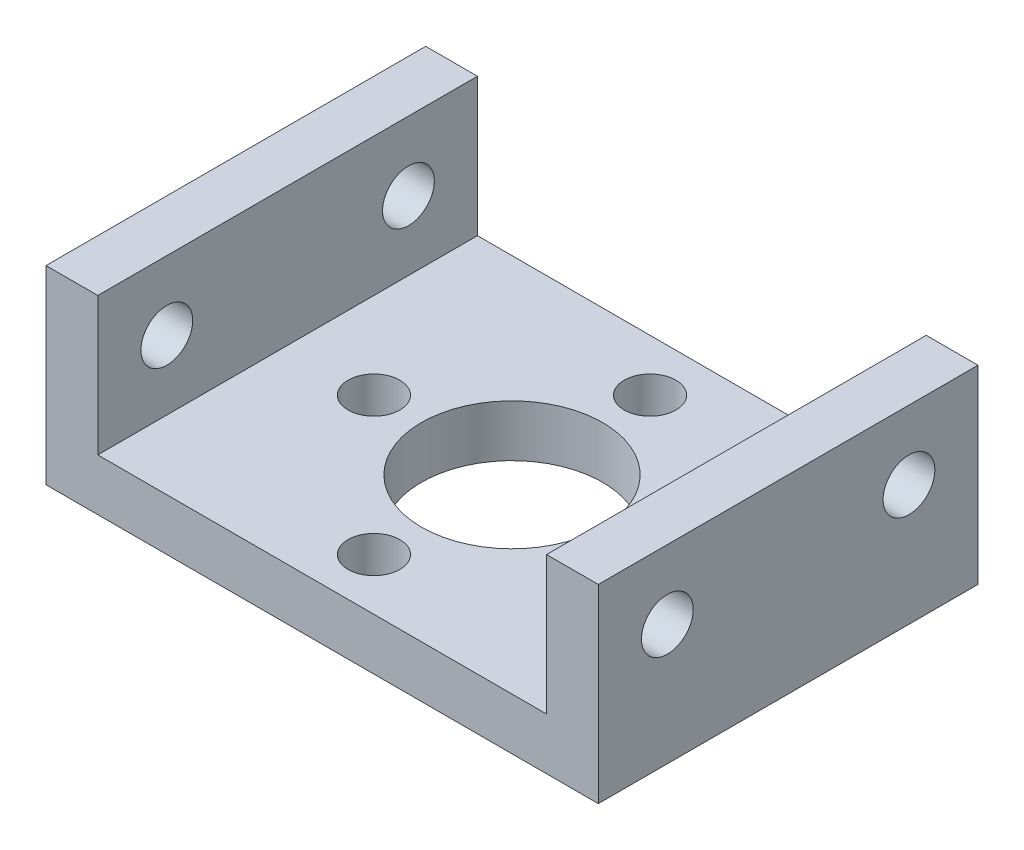
ISO-10303-21;
HEADER;
FILE_DESCRIPTION(('STEP AP214'),'2;1');
FILE_NAME('part.step','',(''),(''),'','','');
FILE_SCHEMA(('AUTOMOTIVE_DESIGN { 1 0 10303 214 1 1 1 1 }'));
ENDSEC;
DATA;
#1=APPLICATION_CONTEXT('core data for automotive mechanical design processes');
#2=APPLICATION_PROTOCOL_DEFINITION('international standard','automotive_design',2000,#1);
#3=PRODUCT_CONTEXT('',#1,'mechanical');
#4=PRODUCT('Part','Part','',(#3));
#5=PRODUCT_RELATED_PRODUCT_CATEGORY('part','',(#4));
#6=PRODUCT_DEFINITION_FORMATION('','',#4);
#7=PRODUCT_DEFINITION_CONTEXT('part definition',#1,'design');
#8=PRODUCT_DEFINITION('design','',#6,#7);
#9=PRODUCT_DEFINITION_SHAPE('','',#8);
#10=(LENGTH_UNIT() NAMED_UNIT(*) SI_UNIT(.MILLI.,.METRE.));
#11=(NAMED_UNIT(*) PLANE_ANGLE_UNIT() SI_UNIT($,.RADIAN.));
#12=(NAMED_UNIT(*) SI_UNIT($,.STERADIAN.) SOLID_ANGLE_UNIT());
#13=UNCERTAINTY_MEASURE_WITH_UNIT(LENGTH_MEASURE(1.E-05),#10,'distance_accuracy_value','');
#14=(GEOMETRIC_REPRESENTATION_CONTEXT(3) GLOBAL_UNCERTAINTY_ASSIGNED_CONTEXT((#13)) GLOBAL_UNIT_ASSIGNED_CONTEXT((#10,
#11,#12)) REPRESENTATION_CONTEXT('',''));
#15=CARTESIAN_POINT('',(0.,0.,0.));
#16=DIRECTION('',(0.,0.,1.));
#17=DIRECTION('',(1.,0.,0.));
#18=AXIS2_PLACEMENT_3D('',#15,#16,#17);
#19=CARTESIAN_POINT('',(0.,3.,0.));
#20=DIRECTION('',(0.,-1.,0.));
#21=DIRECTION('',(0.,0.,-1.));
#22=AXIS2_PLACEMENT_3D('',#19,#20,#21);
#23=PLANE('',#22);
#24=CARTESIAN_POINT('',(0.,3.,-8.));
#25=DIRECTION('',(0.,1.,0.));
#26=DIRECTION('',(0.,0.,1.));
#27=AXIS2_PLACEMENT_3D('',#24,#25,#26);
#28=CIRCLE('',#27,1.5);
#29=CARTESIAN_POINT('',(0.,3.,-6.5));
#30=VERTEX_POINT('',#29);
#31=EDGE_CURVE('E206',#30,#30,#28,.T.);
#32=ORIENTED_EDGE('',*,*,#31,.F.);
#33=EDGE_LOOP('',(#32));
#34=FACE_BOUND('',#33,.T.);
#35=CARTESIAN_POINT('',(8.00000000000023,3.,-2.26393958003914E-13));
#36=DIRECTION('',(0.,1.,0.));
#37=DIRECTION('',(0.,0.,1.));
#38=AXIS2_PLACEMENT_3D('',#35,#36,#37);
#39=CIRCLE('',#38,1.5);
#40=CARTESIAN_POINT('',(8.00000000000023,3.,1.49999999999977));
#41=VERTEX_POINT('',#40);
#42=EDGE_CURVE('E199',#41,#41,#39,.T.);
#43=ORIENTED_EDGE('',*,*,#42,.F.);
#44=EDGE_LOOP('',(#43));
#45=FACE_BOUND('',#44,.T.);
#46=CARTESIAN_POINT('',(4.52787916007828E-13,3.,8.));
#47=DIRECTION('',(0.,1.,0.));
#48=DIRECTION('',(0.,0.,1.));
#49=AXIS2_PLACEMENT_3D('',#46,#47,#48);
#50=CIRCLE('',#49,1.5);
#51=CARTESIAN_POINT('',(4.52787916007828E-13,3.,9.5));
#52=VERTEX_POINT('',#51);
#53=EDGE_CURVE('E217',#52,#52,#50,.T.);
#54=ORIENTED_EDGE('',*,*,#53,.F.);
#55=EDGE_LOOP('',(#54));
#56=FACE_BOUND('',#55,.T.);
#57=CARTESIAN_POINT('',(-7.99999999999977,3.,2.27373675443232E-13));
#58=DIRECTION('',(0.,1.,0.));
#59=DIRECTION('',(0.,0.,1.));
#60=AXIS2_PLACEMENT_3D('',#57,#58,#59);
#61=CIRCLE('',#60,1.5);
#62=CARTESIAN_POINT('',(-7.99999999999977,3.,1.50000000000023));
#63=VERTEX_POINT('',#62);
#64=EDGE_CURVE('E211',#63,#63,#61,.T.);
#65=ORIENTED_EDGE('',*,*,#64,.F.);
#66=EDGE_LOOP('',(#65));
#67=FACE_BOUND('',#66,.T.);
#68=CARTESIAN_POINT('',(0.,3.,0.));
#69=DIRECTION('',(0.,1.,0.));
#70=DIRECTION('',(0.,0.,1.));
#71=AXIS2_PLACEMENT_3D('',#68,#69,#70);
#72=CIRCLE('',#71,5.25);
#73=CARTESIAN_POINT('',(0.,3.,5.25));
#74=VERTEX_POINT('',#73);
#75=EDGE_CURVE('E183',#74,#74,#72,.T.);
#76=ORIENTED_EDGE('',*,*,#75,.F.);
#77=EDGE_LOOP('',(#76));
#78=FACE_BOUND('',#77,.T.);
#79=DIRECTION('',(0.,0.,1.));
#80=VECTOR('',#79,1.);
#81=CARTESIAN_POINT('',(13.,3.,-11.));
#82=LINE('',#81,#80);
#83=CARTESIAN_POINT('',(13.,3.,-11.));
#84=VERTEX_POINT('',#83);
#85=CARTESIAN_POINT('',(13.,3.,11.));
#86=VERTEX_POINT('',#85);
#87=EDGE_CURVE('E52',#84,#86,#82,.T.);
#88=ORIENTED_EDGE('',*,*,#87,.F.);
#89=DIRECTION('',(-1.,0.,0.));
#90=VECTOR('',#89,1.);
#91=CARTESIAN_POINT('',(-16.,3.,-11.));
#92=LINE('',#91,#90);
#93=CARTESIAN_POINT('',(-13.,3.,-11.));
#94=VERTEX_POINT('',#93);
#95=EDGE_CURVE('E151',#84,#94,#92,.T.);
#96=ORIENTED_EDGE('',*,*,#95,.T.);
#97=DIRECTION('',(0.,0.,-1.));
#98=VECTOR('',#97,1.);
#99=CARTESIAN_POINT('',(-13.,3.,-11.));
#100=LINE('',#99,#98);
#101=CARTESIAN_POINT('',(-13.,3.,11.));
#102=VERTEX_POINT('',#101);
#103=EDGE_CURVE('E132',#102,#94,#100,.T.);
#104=ORIENTED_EDGE('',*,*,#103,.F.);
#105=DIRECTION('',(1.,0.,0.));
#106=VECTOR('',#105,1.);
#107=CARTESIAN_POINT('',(-16.,3.,11.));
#108=LINE('',#107,#106);
#109=EDGE_CURVE('E57',#102,#86,#108,.T.);
#110=ORIENTED_EDGE('',*,*,#109,.T.);
#111=EDGE_LOOP('',(#88,#96,#104,#110));
#112=FACE_BOUND('',#111,.T.);
#113=ADVANCED_FACE('F35',(#34,#45,#56,#67,#78,#112),#23,.F.);
#114=CARTESIAN_POINT('',(16.,3.,11.));
#115=DIRECTION('',(-1.,0.,0.));
#116=DIRECTION('',(0.,0.,1.));
#117=AXIS2_PLACEMENT_3D('',#114,#115,#116);
#118=PLANE('',#117);
#119=CARTESIAN_POINT('',(16.,7.,7.));
#120=DIRECTION('',(1.,0.,0.));
#121=DIRECTION('',(0.,0.,-1.));
#122=AXIS2_PLACEMENT_3D('',#119,#120,#121);
#123=CIRCLE('',#122,1.5);
#124=CARTESIAN_POINT('',(16.,7.,5.5));
#125=VERTEX_POINT('',#124);
#126=EDGE_CURVE('E175',#125,#125,#123,.T.);
#127=ORIENTED_EDGE('',*,*,#126,.F.);
#128=EDGE_LOOP('',(#127));
#129=FACE_BOUND('',#128,.T.);
#130=CARTESIAN_POINT('',(16.,7.,-7.));
#131=DIRECTION('',(1.,0.,0.));
#132=DIRECTION('',(0.,0.,-1.));
#133=AXIS2_PLACEMENT_3D('',#130,#131,#132);
#134=CIRCLE('',#133,1.5);
#135=CARTESIAN_POINT('',(16.,7.,-8.5));
#136=VERTEX_POINT('',#135);
#137=EDGE_CURVE('E188',#136,#136,#134,.T.);
#138=ORIENTED_EDGE('',*,*,#137,.F.);
#139=EDGE_LOOP('',(#138));
#140=FACE_BOUND('',#139,.T.);
#141=DIRECTION('',(0.,0.,-1.));
#142=VECTOR('',#141,1.);
#143=CARTESIAN_POINT('',(16.,0.,11.));
#144=LINE('',#143,#142);
#145=CARTESIAN_POINT('',(16.,0.,11.));
#146=VERTEX_POINT('',#145);
#147=CARTESIAN_POINT('',(16.,0.,-11.));
#148=VERTEX_POINT('',#147);
#149=EDGE_CURVE('E105',#146,#148,#144,.T.);
#150=ORIENTED_EDGE('',*,*,#149,.T.);
#151=DIRECTION('',(0.,-1.,0.));
#152=VECTOR('',#151,1.);
#153=CARTESIAN_POINT('',(16.,3.,-11.));
#154=LINE('',#153,#152);
#155=CARTESIAN_POINT('',(16.,11.,-11.));
#156=VERTEX_POINT('',#155);
#157=EDGE_CURVE('E11',#156,#148,#154,.T.);
#158=ORIENTED_EDGE('',*,*,#157,.F.);
#159=DIRECTION('',(0.,0.,-1.));
#160=VECTOR('',#159,1.);
#161=CARTESIAN_POINT('',(16.,11.,-11.));
#162=LINE('',#161,#160);
#163=CARTESIAN_POINT('',(16.,11.,11.));
#164=VERTEX_POINT('',#163);
#165=EDGE_CURVE('E103',#164,#156,#162,.T.);
#166=ORIENTED_EDGE('',*,*,#165,.F.);
#167=DIRECTION('',(0.,-1.,0.));
#168=VECTOR('',#167,1.);
#169=CARTESIAN_POINT('',(16.,3.,11.));
#170=LINE('',#169,#168);
#171=EDGE_CURVE('E155',#164,#146,#170,.T.);
#172=ORIENTED_EDGE('',*,*,#171,.T.);
#173=EDGE_LOOP('',(#150,#158,#166,#172));
#174=FACE_BOUND('',#173,.T.);
#175=ADVANCED_FACE('F37',(#129,#140,#174),#118,.F.);
#176=CARTESIAN_POINT('',(-16.,3.,-11.));
#177=DIRECTION('',(0.,0.,1.));
#178=DIRECTION('',(1.,0.,0.));
#179=AXIS2_PLACEMENT_3D('',#176,#177,#178);
#180=PLANE('',#179);
#181=DIRECTION('',(-1.,0.,0.));
#182=VECTOR('',#181,1.);
#183=CARTESIAN_POINT('',(-16.,0.,-11.));
#184=LINE('',#183,#182);
#185=CARTESIAN_POINT('',(-16.,0.,-11.));
#186=VERTEX_POINT('',#185);
#187=EDGE_CURVE('E157',#148,#186,#184,.T.);
#188=ORIENTED_EDGE('',*,*,#187,.T.);
#189=DIRECTION('',(0.,-1.,0.));
#190=VECTOR('',#189,1.);
#191=CARTESIAN_POINT('',(-16.,3.,-11.));
#192=LINE('',#191,#190);
#193=CARTESIAN_POINT('',(-16.,11.,-11.));
#194=VERTEX_POINT('',#193);
#195=EDGE_CURVE('E44',#194,#186,#192,.T.);
#196=ORIENTED_EDGE('',*,*,#195,.F.);
#197=DIRECTION('',(-1.,0.,0.));
#198=VECTOR('',#197,1.);
#199=CARTESIAN_POINT('',(-16.,11.,-11.));
#200=LINE('',#199,#198);
#201=CARTESIAN_POINT('',(-13.,11.,-11.));
#202=VERTEX_POINT('',#201);
#203=EDGE_CURVE('E140',#202,#194,#200,.T.);
#204=ORIENTED_EDGE('',*,*,#203,.F.);
#205=DIRECTION('',(0.,-1.,0.));
#206=VECTOR('',#205,1.);
#207=CARTESIAN_POINT('',(-13.,11.,-11.));
#208=LINE('',#207,#206);
#209=EDGE_CURVE('E143',#202,#94,#208,.T.);
#210=ORIENTED_EDGE('',*,*,#209,.T.);
#211=ORIENTED_EDGE('',*,*,#95,.F.);
#212=DIRECTION('',(0.,-1.,0.));
#213=VECTOR('',#212,1.);
#214=CARTESIAN_POINT('',(13.,11.,-11.));
#215=LINE('',#214,#213);
#216=CARTESIAN_POINT('',(13.,11.,-11.));
#217=VERTEX_POINT('',#216);
#218=EDGE_CURVE('E111',#217,#84,#215,.T.);
#219=ORIENTED_EDGE('',*,*,#218,.F.);
#220=DIRECTION('',(-1.,0.,0.));
#221=VECTOR('',#220,1.);
#222=CARTESIAN_POINT('',(16.,11.,-11.));
#223=LINE('',#222,#221);
#224=EDGE_CURVE('E108',#156,#217,#223,.T.);
#225=ORIENTED_EDGE('',*,*,#224,.F.);
#226=ORIENTED_EDGE('',*,*,#157,.T.);
#227=EDGE_LOOP('',(#188,#196,#204,#210,#211,#219,#225,#226));
#228=FACE_BOUND('',#227,.T.);
#229=ADVANCED_FACE('F109',(#228),#180,.F.);
#230=CARTESIAN_POINT('',(-16.,3.,11.));
#231=DIRECTION('',(1.,0.,0.));
#232=DIRECTION('',(0.,0.,-1.));
#233=AXIS2_PLACEMENT_3D('',#230,#231,#232);
#234=PLANE('',#233);
#235=CARTESIAN_POINT('',(-16.,7.,7.));
#236=DIRECTION('',(1.,0.,0.));
#237=DIRECTION('',(0.,0.,-1.));
#238=AXIS2_PLACEMENT_3D('',#235,#236,#237);
#239=CIRCLE('',#238,1.5);
#240=CARTESIAN_POINT('',(-16.,7.,5.5));
#241=VERTEX_POINT('',#240);
#242=EDGE_CURVE('E170',#241,#241,#239,.T.);
#243=ORIENTED_EDGE('',*,*,#242,.T.);
#244=EDGE_LOOP('',(#243));
#245=FACE_BOUND('',#244,.T.);
#246=CARTESIAN_POINT('',(-16.,7.,-7.));
#247=DIRECTION('',(1.,0.,0.));
#248=DIRECTION('',(0.,0.,-1.));
#249=AXIS2_PLACEMENT_3D('',#246,#247,#248);
#250=CIRCLE('',#249,1.5);
#251=CARTESIAN_POINT('',(-16.,7.,-8.5));
#252=VERTEX_POINT('',#251);
#253=EDGE_CURVE('E180',#252,#252,#250,.T.);
#254=ORIENTED_EDGE('',*,*,#253,.T.);
#255=EDGE_LOOP('',(#254));
#256=FACE_BOUND('',#255,.T.);
#257=DIRECTION('',(0.,0.,1.));
#258=VECTOR('',#257,1.);
#259=CARTESIAN_POINT('',(-16.,0.,11.));
#260=LINE('',#259,#258);
#261=CARTESIAN_POINT('',(-16.,0.,11.));
#262=VERTEX_POINT('',#261);
#263=EDGE_CURVE('E159',#186,#262,#260,.T.);
#264=ORIENTED_EDGE('',*,*,#263,.T.);
#265=DIRECTION('',(0.,-1.,0.));
#266=VECTOR('',#265,1.);
#267=CARTESIAN_POINT('',(-16.,3.,11.));
#268=LINE('',#267,#266);
#269=CARTESIAN_POINT('',(-16.,11.,11.));
#270=VERTEX_POINT('',#269);
#271=EDGE_CURVE('E163',#270,#262,#268,.T.);
#272=ORIENTED_EDGE('',*,*,#271,.F.);
#273=DIRECTION('',(0.,0.,1.));
#274=VECTOR('',#273,1.);
#275=CARTESIAN_POINT('',(-16.,11.,-11.));
#276=LINE('',#275,#274);
#277=EDGE_CURVE('E133',#194,#270,#276,.T.);
#278=ORIENTED_EDGE('',*,*,#277,.F.);
#279=ORIENTED_EDGE('',*,*,#195,.T.);
#280=EDGE_LOOP('',(#264,#272,#278,#279));
#281=FACE_BOUND('',#280,.T.);
#282=ADVANCED_FACE('F284',(#245,#256,#281),#234,.F.);
#283=CARTESIAN_POINT('',(-16.,3.,11.));
#284=DIRECTION('',(0.,0.,-1.));
#285=DIRECTION('',(-1.,0.,0.));
#286=AXIS2_PLACEMENT_3D('',#283,#284,#285);
#287=PLANE('',#286);
#288=DIRECTION('',(1.,0.,0.));
#289=VECTOR('',#288,1.);
#290=CARTESIAN_POINT('',(-16.,0.,11.));
#291=LINE('',#290,#289);
#292=EDGE_CURVE('E153',#262,#146,#291,.T.);
#293=ORIENTED_EDGE('',*,*,#292,.T.);
#294=ORIENTED_EDGE('',*,*,#171,.F.);
#295=DIRECTION('',(1.,0.,0.));
#296=VECTOR('',#295,1.);
#297=CARTESIAN_POINT('',(16.,11.,11.));
#298=LINE('',#297,#296);
#299=CARTESIAN_POINT('',(13.,11.,11.));
#300=VERTEX_POINT('',#299);
#301=EDGE_CURVE('E119',#300,#164,#298,.T.);
#302=ORIENTED_EDGE('',*,*,#301,.F.);
#303=DIRECTION('',(0.,-1.,0.));
#304=VECTOR('',#303,1.);
#305=CARTESIAN_POINT('',(13.,11.,11.));
#306=LINE('',#305,#304);
#307=EDGE_CURVE('E127',#300,#86,#306,.T.);
#308=ORIENTED_EDGE('',*,*,#307,.T.);
#309=ORIENTED_EDGE('',*,*,#109,.F.);
#310=DIRECTION('',(0.,-1.,0.));
#311=VECTOR('',#310,1.);
#312=CARTESIAN_POINT('',(-13.,11.,11.));
#313=LINE('',#312,#311);
#314=CARTESIAN_POINT('',(-13.,11.,11.));
#315=VERTEX_POINT('',#314);
#316=EDGE_CURVE('E148',#315,#102,#313,.T.);
#317=ORIENTED_EDGE('',*,*,#316,.F.);
#318=DIRECTION('',(1.,0.,0.));
#319=VECTOR('',#318,1.);
#320=CARTESIAN_POINT('',(-16.,11.,11.));
#321=LINE('',#320,#319);
#322=EDGE_CURVE('E136',#270,#315,#321,.T.);
#323=ORIENTED_EDGE('',*,*,#322,.F.);
#324=ORIENTED_EDGE('',*,*,#271,.T.);
#325=EDGE_LOOP('',(#293,#294,#302,#308,#309,#317,#323,#324));
#326=FACE_BOUND('',#325,.T.);
#327=ADVANCED_FACE('F280',(#326),#287,.F.);
#328=CARTESIAN_POINT('',(0.,0.,0.));
#329=DIRECTION('',(0.,-1.,0.));
#330=DIRECTION('',(0.,0.,-1.));
#331=AXIS2_PLACEMENT_3D('',#328,#329,#330);
#332=PLANE('',#331);
#333=CARTESIAN_POINT('',(0.,0.,-8.));
#334=DIRECTION('',(0.,1.,0.));
#335=DIRECTION('',(0.,0.,1.));
#336=AXIS2_PLACEMENT_3D('',#333,#334,#335);
#337=CIRCLE('',#336,1.5);
#338=CARTESIAN_POINT('',(0.,0.,-6.5));
#339=VERTEX_POINT('',#338);
#340=EDGE_CURVE('E197',#339,#339,#337,.T.);
#341=ORIENTED_EDGE('',*,*,#340,.T.);
#342=EDGE_LOOP('',(#341));
#343=FACE_BOUND('',#342,.T.);
#344=CARTESIAN_POINT('',(8.00000000000023,0.,-2.26393958003914E-13));
#345=DIRECTION('',(0.,1.,0.));
#346=DIRECTION('',(0.,0.,1.));
#347=AXIS2_PLACEMENT_3D('',#344,#345,#346);
#348=CIRCLE('',#347,1.5);
#349=CARTESIAN_POINT('',(8.00000000000023,0.,1.49999999999977));
#350=VERTEX_POINT('',#349);
#351=EDGE_CURVE('E202',#350,#350,#348,.T.);
#352=ORIENTED_EDGE('',*,*,#351,.T.);
#353=EDGE_LOOP('',(#352));
#354=FACE_BOUND('',#353,.T.);
#355=CARTESIAN_POINT('',(4.52787916007828E-13,0.,8.));
#356=DIRECTION('',(0.,1.,0.));
#357=DIRECTION('',(0.,0.,1.));
#358=AXIS2_PLACEMENT_3D('',#355,#356,#357);
#359=CIRCLE('',#358,1.5);
#360=CARTESIAN_POINT('',(4.52787916007828E-13,0.,9.5));
#361=VERTEX_POINT('',#360);
#362=EDGE_CURVE('E203',#361,#361,#359,.T.);
#363=ORIENTED_EDGE('',*,*,#362,.T.);
#364=EDGE_LOOP('',(#363));
#365=FACE_BOUND('',#364,.T.);
#366=CARTESIAN_POINT('',(-7.99999999999977,0.,2.27373675443232E-13));
#367=DIRECTION('',(0.,1.,0.));
#368=DIRECTION('',(0.,0.,1.));
#369=AXIS2_PLACEMENT_3D('',#366,#367,#368);
#370=CIRCLE('',#369,1.5);
#371=CARTESIAN_POINT('',(-7.99999999999977,0.,1.50000000000023));
#372=VERTEX_POINT('',#371);
#373=EDGE_CURVE('E214',#372,#372,#370,.T.);
#374=ORIENTED_EDGE('',*,*,#373,.T.);
#375=EDGE_LOOP('',(#374));
#376=FACE_BOUND('',#375,.T.);
#377=CARTESIAN_POINT('',(0.,0.,0.));
#378=DIRECTION('',(0.,1.,0.));
#379=DIRECTION('',(0.,0.,1.));
#380=AXIS2_PLACEMENT_3D('',#377,#378,#379);
#381=CIRCLE('',#380,5.25);
#382=CARTESIAN_POINT('',(0.,0.,5.25));
#383=VERTEX_POINT('',#382);
#384=EDGE_CURVE('E190',#383,#383,#381,.T.);
#385=ORIENTED_EDGE('',*,*,#384,.T.);
#386=EDGE_LOOP('',(#385));
#387=FACE_BOUND('',#386,.T.);
#388=ORIENTED_EDGE('',*,*,#149,.F.);
#389=ORIENTED_EDGE('',*,*,#292,.F.);
#390=ORIENTED_EDGE('',*,*,#263,.F.);
#391=ORIENTED_EDGE('',*,*,#187,.F.);
#392=EDGE_LOOP('',(#388,#389,#390,#391));
#393=FACE_BOUND('',#392,.T.);
#394=ADVANCED_FACE('F223',(#343,#354,#365,#376,#387,#393),#332,.T.);
#395=CARTESIAN_POINT('',(-13.,11.,-11.));
#396=DIRECTION('',(-1.,0.,0.));
#397=DIRECTION('',(0.,0.,1.));
#398=AXIS2_PLACEMENT_3D('',#395,#396,#397);
#399=PLANE('',#398);
#400=CARTESIAN_POINT('',(-13.,7.,7.));
#401=DIRECTION('',(-1.,0.,0.));
#402=DIRECTION('',(0.,0.,1.));
#403=AXIS2_PLACEMENT_3D('',#400,#401,#402);
#404=CIRCLE('',#403,1.5);
#405=CARTESIAN_POINT('',(-13.,7.,8.5));
#406=VERTEX_POINT('',#405);
#407=EDGE_CURVE('E121',#406,#406,#404,.T.);
#408=ORIENTED_EDGE('',*,*,#407,.T.);
#409=EDGE_LOOP('',(#408));
#410=FACE_BOUND('',#409,.T.);
#411=CARTESIAN_POINT('',(-13.,7.,-7.));
#412=DIRECTION('',(-1.,0.,0.));
#413=DIRECTION('',(0.,0.,1.));
#414=AXIS2_PLACEMENT_3D('',#411,#412,#413);
#415=CIRCLE('',#414,1.5);
#416=CARTESIAN_POINT('',(-13.,7.,-5.5));
#417=VERTEX_POINT('',#416);
#418=EDGE_CURVE('E169',#417,#417,#415,.T.);
#419=ORIENTED_EDGE('',*,*,#418,.T.);
#420=EDGE_LOOP('',(#419));
#421=FACE_BOUND('',#420,.T.);
#422=ORIENTED_EDGE('',*,*,#103,.T.);
#423=ORIENTED_EDGE('',*,*,#209,.F.);
#424=DIRECTION('',(0.,0.,-1.));
#425=VECTOR('',#424,1.);
#426=CARTESIAN_POINT('',(-13.,11.,-11.));
#427=LINE('',#426,#425);
#428=EDGE_CURVE('E138',#315,#202,#427,.T.);
#429=ORIENTED_EDGE('',*,*,#428,.F.);
#430=ORIENTED_EDGE('',*,*,#316,.T.);
#431=EDGE_LOOP('',(#422,#423,#429,#430));
#432=FACE_BOUND('',#431,.T.);
#433=ADVANCED_FACE('F273',(#410,#421,#432),#399,.F.);
#434=CARTESIAN_POINT('',(0.,11.,0.));
#435=DIRECTION('',(0.,1.,0.));
#436=DIRECTION('',(0.,0.,1.));
#437=AXIS2_PLACEMENT_3D('',#434,#435,#436);
#438=PLANE('',#437);
#439=ORIENTED_EDGE('',*,*,#277,.T.);
#440=ORIENTED_EDGE('',*,*,#322,.T.);
#441=ORIENTED_EDGE('',*,*,#428,.T.);
#442=ORIENTED_EDGE('',*,*,#203,.T.);
#443=EDGE_LOOP('',(#439,#440,#441,#442));
#444=FACE_BOUND('',#443,.T.);
#445=ADVANCED_FACE('F269',(#444),#438,.T.);
#446=CARTESIAN_POINT('',(13.,11.,-11.));
#447=DIRECTION('',(1.,0.,0.));
#448=DIRECTION('',(0.,0.,-1.));
#449=AXIS2_PLACEMENT_3D('',#446,#447,#448);
#450=PLANE('',#449);
#451=CARTESIAN_POINT('',(13.,7.,7.));
#452=DIRECTION('',(1.,0.,0.));
#453=DIRECTION('',(0.,0.,-1.));
#454=AXIS2_PLACEMENT_3D('',#451,#452,#453);
#455=CIRCLE('',#454,1.5);
#456=CARTESIAN_POINT('',(13.,7.,5.5));
#457=VERTEX_POINT('',#456);
#458=EDGE_CURVE('E39',#457,#457,#455,.T.);
#459=ORIENTED_EDGE('',*,*,#458,.T.);
#460=EDGE_LOOP('',(#459));
#461=FACE_BOUND('',#460,.T.);
#462=CARTESIAN_POINT('',(13.,7.,-7.));
#463=DIRECTION('',(1.,0.,0.));
#464=DIRECTION('',(0.,0.,-1.));
#465=AXIS2_PLACEMENT_3D('',#462,#463,#464);
#466=CIRCLE('',#465,1.5);
#467=CARTESIAN_POINT('',(13.,7.,-8.5));
#468=VERTEX_POINT('',#467);
#469=EDGE_CURVE('E167',#468,#468,#466,.T.);
#470=ORIENTED_EDGE('',*,*,#469,.T.);
#471=EDGE_LOOP('',(#470));
#472=FACE_BOUND('',#471,.T.);
#473=ORIENTED_EDGE('',*,*,#87,.T.);
#474=ORIENTED_EDGE('',*,*,#307,.F.);
#475=DIRECTION('',(0.,0.,1.));
#476=VECTOR('',#475,1.);
#477=CARTESIAN_POINT('',(13.,11.,-11.));
#478=LINE('',#477,#476);
#479=EDGE_CURVE('E114',#217,#300,#478,.T.);
#480=ORIENTED_EDGE('',*,*,#479,.F.);
#481=ORIENTED_EDGE('',*,*,#218,.T.);
#482=EDGE_LOOP('',(#473,#474,#480,#481));
#483=FACE_BOUND('',#482,.T.);
#484=ADVANCED_FACE('F266',(#461,#472,#483),#450,.F.);
#485=CARTESIAN_POINT('',(0.,11.,0.));
#486=DIRECTION('',(0.,-1.,0.));
#487=DIRECTION('',(0.,0.,-1.));
#488=AXIS2_PLACEMENT_3D('',#485,#486,#487);
#489=PLANE('',#488);
#490=ORIENTED_EDGE('',*,*,#165,.T.);
#491=ORIENTED_EDGE('',*,*,#224,.T.);
#492=ORIENTED_EDGE('',*,*,#479,.T.);
#493=ORIENTED_EDGE('',*,*,#301,.T.);
#494=EDGE_LOOP('',(#490,#491,#492,#493));
#495=FACE_BOUND('',#494,.T.);
#496=ADVANCED_FACE('F117',(#495),#489,.F.);
#497=CARTESIAN_POINT('',(-16.,7.,-7.));
#498=DIRECTION('',(1.,0.,0.));
#499=DIRECTION('',(0.,0.,-1.));
#500=AXIS2_PLACEMENT_3D('',#497,#498,#499);
#501=CYLINDRICAL_SURFACE('',#500,1.5);
#502=ORIENTED_EDGE('',*,*,#137,.T.);
#503=EDGE_LOOP('',(#502));
#504=FACE_BOUND('',#503,.T.);
#505=ORIENTED_EDGE('',*,*,#469,.F.);
#506=EDGE_LOOP('',(#505));
#507=FACE_BOUND('',#506,.T.);
#508=ADVANCED_FACE('F263',(#504,#507),#501,.F.);
#509=CARTESIAN_POINT('',(-16.,7.,7.));
#510=DIRECTION('',(1.,0.,0.));
#511=DIRECTION('',(0.,0.,-1.));
#512=AXIS2_PLACEMENT_3D('',#509,#510,#511);
#513=CYLINDRICAL_SURFACE('',#512,1.5);
#514=ORIENTED_EDGE('',*,*,#126,.T.);
#515=EDGE_LOOP('',(#514));
#516=FACE_BOUND('',#515,.T.);
#517=ORIENTED_EDGE('',*,*,#458,.F.);
#518=EDGE_LOOP('',(#517));
#519=FACE_BOUND('',#518,.T.);
#520=ADVANCED_FACE('F256',(#516,#519),#513,.F.);
#521=ORIENTED_EDGE('',*,*,#253,.F.);
#522=EDGE_LOOP('',(#521));
#523=FACE_BOUND('',#522,.T.);
#524=ORIENTED_EDGE('',*,*,#418,.F.);
#525=EDGE_LOOP('',(#524));
#526=FACE_BOUND('',#525,.T.);
#527=ADVANCED_FACE('F253',(#523,#526),#501,.F.);
#528=ORIENTED_EDGE('',*,*,#242,.F.);
#529=EDGE_LOOP('',(#528));
#530=FACE_BOUND('',#529,.T.);
#531=ORIENTED_EDGE('',*,*,#407,.F.);
#532=EDGE_LOOP('',(#531));
#533=FACE_BOUND('',#532,.T.);
#534=ADVANCED_FACE('F244',(#530,#533),#513,.F.);
#535=CARTESIAN_POINT('',(0.,0.,0.));
#536=DIRECTION('',(0.,1.,0.));
#537=DIRECTION('',(0.,0.,1.));
#538=AXIS2_PLACEMENT_3D('',#535,#536,#537);
#539=CYLINDRICAL_SURFACE('',#538,5.25);
#540=ORIENTED_EDGE('',*,*,#384,.F.);
#541=EDGE_LOOP('',(#540));
#542=FACE_BOUND('',#541,.T.);
#543=ORIENTED_EDGE('',*,*,#75,.T.);
#544=EDGE_LOOP('',(#543));
#545=FACE_BOUND('',#544,.T.);
#546=ADVANCED_FACE('F242',(#542,#545),#539,.F.);
#547=CARTESIAN_POINT('',(-7.99999999999977,0.,2.27373675443232E-13));
#548=DIRECTION('',(0.,1.,0.));
#549=DIRECTION('',(0.,0.,1.));
#550=AXIS2_PLACEMENT_3D('',#547,#548,#549);
#551=CYLINDRICAL_SURFACE('',#550,1.5);
#552=ORIENTED_EDGE('',*,*,#373,.F.);
#553=EDGE_LOOP('',(#552));
#554=FACE_BOUND('',#553,.T.);
#555=ORIENTED_EDGE('',*,*,#64,.T.);
#556=EDGE_LOOP('',(#555));
#557=FACE_BOUND('',#556,.T.);
#558=ADVANCED_FACE('F230',(#554,#557),#551,.F.);
#559=CARTESIAN_POINT('',(4.52787916007828E-13,0.,8.));
#560=DIRECTION('',(0.,1.,0.));
#561=DIRECTION('',(0.,0.,1.));
#562=AXIS2_PLACEMENT_3D('',#559,#560,#561);
#563=CYLINDRICAL_SURFACE('',#562,1.5);
#564=ORIENTED_EDGE('',*,*,#362,.F.);
#565=EDGE_LOOP('',(#564));
#566=FACE_BOUND('',#565,.T.);
#567=ORIENTED_EDGE('',*,*,#53,.T.);
#568=EDGE_LOOP('',(#567));
#569=FACE_BOUND('',#568,.T.);
#570=ADVANCED_FACE('F226',(#566,#569),#563,.F.);
#571=CARTESIAN_POINT('',(8.00000000000023,0.,-2.26393958003914E-13));
#572=DIRECTION('',(0.,1.,0.));
#573=DIRECTION('',(0.,0.,1.));
#574=AXIS2_PLACEMENT_3D('',#571,#572,#573);
#575=CYLINDRICAL_SURFACE('',#574,1.5);
#576=ORIENTED_EDGE('',*,*,#351,.F.);
#577=EDGE_LOOP('',(#576));
#578=FACE_BOUND('',#577,.T.);
#579=ORIENTED_EDGE('',*,*,#42,.T.);
#580=EDGE_LOOP('',(#579));
#581=FACE_BOUND('',#580,.T.);
#582=ADVANCED_FACE('F229',(#578,#581),#575,.F.);
#583=CARTESIAN_POINT('',(0.,0.,-8.));
#584=DIRECTION('',(0.,1.,0.));
#585=DIRECTION('',(0.,0.,1.));
#586=AXIS2_PLACEMENT_3D('',#583,#584,#585);
#587=CYLINDRICAL_SURFACE('',#586,1.5);
#588=ORIENTED_EDGE('',*,*,#340,.F.);
#589=EDGE_LOOP('',(#588));
#590=FACE_BOUND('',#589,.T.);
#591=ORIENTED_EDGE('',*,*,#31,.T.);
#592=EDGE_LOOP('',(#591));
#593=FACE_BOUND('',#592,.T.);
#594=ADVANCED_FACE('F436',(#590,#593),#587,.F.);
#595=CLOSED_SHELL('',(#113,#175,#229,#282,#327,#394,#433,#445,#484,#496,#508,#520,#527,#534,
#546,#558,#570,#582,#594));
#596=MANIFOLD_SOLID_BREP('B2',#595);
#597=ADVANCED_BREP_SHAPE_REPRESENTATION('',(#18,#596),#14);
#598=SHAPE_DEFINITION_REPRESENTATION(#9,#597);
ENDSEC;
END-ISO-10303-21;
